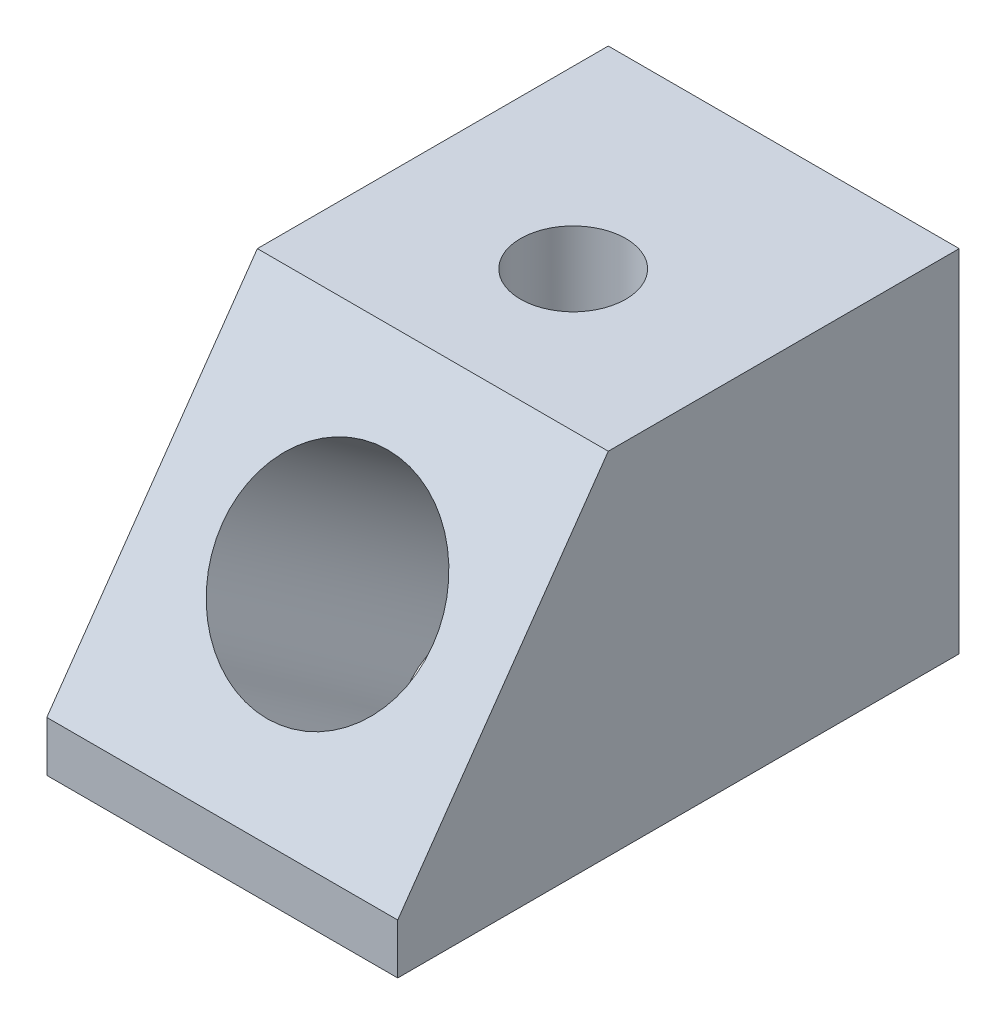
ISO-10303-21;
HEADER;
FILE_DESCRIPTION(('STEP AP214'),'2;1');
FILE_NAME('part.step','',(''),(''),'','','');
FILE_SCHEMA(('AUTOMOTIVE_DESIGN { 1 0 10303 214 1 1 1 1 }'));
ENDSEC;
DATA;
#1=APPLICATION_CONTEXT('core data for automotive mechanical design processes');
#2=APPLICATION_PROTOCOL_DEFINITION('international standard','automotive_design',2000,#1);
#3=PRODUCT_CONTEXT('',#1,'mechanical');
#4=PRODUCT('Part','Part','',(#3));
#5=PRODUCT_RELATED_PRODUCT_CATEGORY('part','',(#4));
#6=PRODUCT_DEFINITION_FORMATION('','',#4);
#7=PRODUCT_DEFINITION_CONTEXT('part definition',#1,'design');
#8=PRODUCT_DEFINITION('design','',#6,#7);
#9=PRODUCT_DEFINITION_SHAPE('','',#8);
#10=(LENGTH_UNIT() NAMED_UNIT(*) SI_UNIT(.MILLI.,.METRE.));
#11=(NAMED_UNIT(*) PLANE_ANGLE_UNIT() SI_UNIT($,.RADIAN.));
#12=(NAMED_UNIT(*) SI_UNIT($,.STERADIAN.) SOLID_ANGLE_UNIT());
#13=UNCERTAINTY_MEASURE_WITH_UNIT(LENGTH_MEASURE(1.E-05),#10,'distance_accuracy_value','');
#14=(GEOMETRIC_REPRESENTATION_CONTEXT(3) GLOBAL_UNCERTAINTY_ASSIGNED_CONTEXT((#13)) GLOBAL_UNIT_ASSIGNED_CONTEXT((#10,
#11,#12)) REPRESENTATION_CONTEXT('',''));
#15=CARTESIAN_POINT('',(0.,0.,0.));
#16=DIRECTION('',(0.,0.,1.));
#17=DIRECTION('',(1.,0.,0.));
#18=AXIS2_PLACEMENT_3D('',#15,#16,#17);
#19=CARTESIAN_POINT('',(0.,10.,0.));
#20=DIRECTION('',(0.,-1.,0.));
#21=DIRECTION('',(0.,0.,-1.));
#22=AXIS2_PLACEMENT_3D('',#19,#20,#21);
#23=PLANE('',#22);
#24=DIRECTION('',(0.,0.,1.));
#25=VECTOR('',#24,1.);
#26=CARTESIAN_POINT('',(0.,10.,0.));
#27=LINE('',#26,#25);
#28=CARTESIAN_POINT('',(0.,10.,-16.));
#29=VERTEX_POINT('',#28);
#30=CARTESIAN_POINT('',(0.,10.,-6.));
#31=VERTEX_POINT('',#30);
#32=EDGE_CURVE('E120',#29,#31,#27,.T.);
#33=ORIENTED_EDGE('',*,*,#32,.T.);
#34=DIRECTION('',(1.,0.,0.));
#35=VECTOR('',#34,1.);
#36=CARTESIAN_POINT('',(-10.4606807737266,10.,-6.));
#37=LINE('',#36,#35);
#38=CARTESIAN_POINT('',(10.,10.,-6.));
#39=VERTEX_POINT('',#38);
#40=EDGE_CURVE('E161',#31,#39,#37,.T.);
#41=ORIENTED_EDGE('',*,*,#40,.T.);
#42=DIRECTION('',(0.,0.,-1.));
#43=VECTOR('',#42,1.);
#44=CARTESIAN_POINT('',(10.,10.,0.));
#45=LINE('',#44,#43);
#46=CARTESIAN_POINT('',(10.,10.,-16.));
#47=VERTEX_POINT('',#46);
#48=EDGE_CURVE('E125',#39,#47,#45,.T.);
#49=ORIENTED_EDGE('',*,*,#48,.T.);
#50=DIRECTION('',(-1.,0.,0.));
#51=VECTOR('',#50,1.);
#52=CARTESIAN_POINT('',(0.,10.,-16.));
#53=LINE('',#52,#51);
#54=EDGE_CURVE('E135',#47,#29,#53,.T.);
#55=ORIENTED_EDGE('',*,*,#54,.T.);
#56=EDGE_LOOP('',(#33,#41,#49,#55));
#57=FACE_BOUND('',#56,.T.);
#58=CARTESIAN_POINT('',(5.,10.,-10.));
#59=DIRECTION('',(0.,1.,0.));
#60=DIRECTION('',(0.,0.,1.));
#61=AXIS2_PLACEMENT_3D('',#58,#59,#60);
#62=CIRCLE('',#61,1.5);
#63=CARTESIAN_POINT('',(5.,10.,-8.5));
#64=VERTEX_POINT('',#63);
#65=EDGE_CURVE('E154',#64,#64,#62,.T.);
#66=ORIENTED_EDGE('',*,*,#65,.F.);
#67=EDGE_LOOP('',(#66));
#68=FACE_BOUND('',#67,.T.);
#69=ADVANCED_FACE('F45',(#57,#68),#23,.F.);
#70=CARTESIAN_POINT('',(0.,0.,0.));
#71=DIRECTION('',(0.,-1.,0.));
#72=DIRECTION('',(0.,0.,-1.));
#73=AXIS2_PLACEMENT_3D('',#70,#71,#72);
#74=PLANE('',#73);
#75=CARTESIAN_POINT('',(5.,0.,-11.1626598799367));
#76=DIRECTION('',(0.,-1.,0.));
#77=DIRECTION('',(0.,0.,1.));
#78=AXIS2_PLACEMENT_3D('',#75,#76,#77);
#79=ELLIPSE('',#78,5.23034038686332,3.);
#80=CARTESIAN_POINT('',(6.14091275769209,0.,-16.));
#81=VERTEX_POINT('',#80);
#82=CARTESIAN_POINT('',(3.85908724230791,0.,-16.));
#83=VERTEX_POINT('',#82);
#84=EDGE_CURVE('E60',#81,#83,#79,.T.);
#85=ORIENTED_EDGE('',*,*,#84,.F.);
#86=DIRECTION('',(-1.,0.,0.));
#87=VECTOR('',#86,1.);
#88=CARTESIAN_POINT('',(0.,0.,-16.));
#89=LINE('',#88,#87);
#90=CARTESIAN_POINT('',(10.,0.,-16.));
#91=VERTEX_POINT('',#90);
#92=EDGE_CURVE('E108',#91,#81,#89,.T.);
#93=ORIENTED_EDGE('',*,*,#92,.F.);
#94=DIRECTION('',(0.,0.,-1.));
#95=VECTOR('',#94,1.);
#96=CARTESIAN_POINT('',(10.,0.,0.));
#97=LINE('',#96,#95);
#98=CARTESIAN_POINT('',(10.,0.,0.));
#99=VERTEX_POINT('',#98);
#100=EDGE_CURVE('E127',#99,#91,#97,.T.);
#101=ORIENTED_EDGE('',*,*,#100,.F.);
#102=DIRECTION('',(1.,0.,0.));
#103=VECTOR('',#102,1.);
#104=CARTESIAN_POINT('',(0.,0.,0.));
#105=LINE('',#104,#103);
#106=CARTESIAN_POINT('',(0.,0.,0.));
#107=VERTEX_POINT('',#106);
#108=EDGE_CURVE('E145',#107,#99,#105,.T.);
#109=ORIENTED_EDGE('',*,*,#108,.F.);
#110=DIRECTION('',(0.,0.,1.));
#111=VECTOR('',#110,1.);
#112=CARTESIAN_POINT('',(0.,0.,0.));
#113=LINE('',#112,#111);
#114=CARTESIAN_POINT('',(0.,0.,-16.));
#115=VERTEX_POINT('',#114);
#116=EDGE_CURVE('E150',#115,#107,#113,.T.);
#117=ORIENTED_EDGE('',*,*,#116,.F.);
#118=EDGE_CURVE('E110',#83,#115,#89,.T.);
#119=ORIENTED_EDGE('',*,*,#118,.F.);
#120=EDGE_LOOP('',(#85,#93,#101,#109,#117,#119));
#121=FACE_BOUND('',#120,.T.);
#122=ADVANCED_FACE('F106',(#121),#74,.T.);
#123=CARTESIAN_POINT('',(0.,10.,0.));
#124=DIRECTION('',(1.,0.,0.));
#125=DIRECTION('',(0.,0.,-1.));
#126=AXIS2_PLACEMENT_3D('',#123,#124,#125);
#127=PLANE('',#126);
#128=DIRECTION('',(0.,-1.,0.));
#129=VECTOR('',#128,1.);
#130=CARTESIAN_POINT('',(0.,10.,0.));
#131=LINE('',#130,#129);
#132=CARTESIAN_POINT('',(0.,1.43111195954726,0.));
#133=VERTEX_POINT('',#132);
#134=EDGE_CURVE('E11',#133,#107,#131,.T.);
#135=ORIENTED_EDGE('',*,*,#134,.F.);
#136=DIRECTION('',(0.,-0.819152044288993,0.573576436351044));
#137=VECTOR('',#136,1.);
#138=CARTESIAN_POINT('',(0.,1.43111195954726,0.));
#139=LINE('',#138,#137);
#140=EDGE_CURVE('E158',#31,#133,#139,.T.);
#141=ORIENTED_EDGE('',*,*,#140,.F.);
#142=ORIENTED_EDGE('',*,*,#32,.F.);
#143=DIRECTION('',(0.,-1.,0.));
#144=VECTOR('',#143,1.);
#145=CARTESIAN_POINT('',(0.,10.,-16.));
#146=LINE('',#145,#144);
#147=EDGE_CURVE('E131',#29,#115,#146,.T.);
#148=ORIENTED_EDGE('',*,*,#147,.T.);
#149=ORIENTED_EDGE('',*,*,#116,.T.);
#150=EDGE_LOOP('',(#135,#141,#142,#148,#149));
#151=FACE_BOUND('',#150,.T.);
#152=ADVANCED_FACE('F47',(#151),#127,.F.);
#153=CARTESIAN_POINT('',(0.,10.,0.));
#154=DIRECTION('',(0.,0.,-1.));
#155=DIRECTION('',(-1.,0.,0.));
#156=AXIS2_PLACEMENT_3D('',#153,#154,#155);
#157=PLANE('',#156);
#158=DIRECTION('',(0.,-1.,0.));
#159=VECTOR('',#158,1.);
#160=CARTESIAN_POINT('',(10.,10.,0.));
#161=LINE('',#160,#159);
#162=CARTESIAN_POINT('',(10.,1.43111195954726,0.));
#163=VERTEX_POINT('',#162);
#164=EDGE_CURVE('E54',#163,#99,#161,.T.);
#165=ORIENTED_EDGE('',*,*,#164,.F.);
#166=DIRECTION('',(1.,0.,0.));
#167=VECTOR('',#166,1.);
#168=CARTESIAN_POINT('',(-10.4606807737266,1.43111195954726,0.));
#169=LINE('',#168,#167);
#170=EDGE_CURVE('E68',#133,#163,#169,.T.);
#171=ORIENTED_EDGE('',*,*,#170,.F.);
#172=ORIENTED_EDGE('',*,*,#134,.T.);
#173=ORIENTED_EDGE('',*,*,#108,.T.);
#174=EDGE_LOOP('',(#165,#171,#172,#173));
#175=FACE_BOUND('',#174,.T.);
#176=ADVANCED_FACE('F146',(#175),#157,.F.);
#177=CARTESIAN_POINT('',(10.,10.,0.));
#178=DIRECTION('',(-1.,0.,0.));
#179=DIRECTION('',(0.,0.,1.));
#180=AXIS2_PLACEMENT_3D('',#177,#178,#179);
#181=PLANE('',#180);
#182=ORIENTED_EDGE('',*,*,#48,.F.);
#183=DIRECTION('',(0.,0.819152044288993,-0.573576436351044));
#184=VECTOR('',#183,1.);
#185=CARTESIAN_POINT('',(10.,1.43111195954726,0.));
#186=LINE('',#185,#184);
#187=EDGE_CURVE('E112',#163,#39,#186,.T.);
#188=ORIENTED_EDGE('',*,*,#187,.F.);
#189=ORIENTED_EDGE('',*,*,#164,.T.);
#190=ORIENTED_EDGE('',*,*,#100,.T.);
#191=DIRECTION('',(0.,-1.,0.));
#192=VECTOR('',#191,1.);
#193=CARTESIAN_POINT('',(10.,10.,-16.));
#194=LINE('',#193,#192);
#195=EDGE_CURVE('E118',#47,#91,#194,.T.);
#196=ORIENTED_EDGE('',*,*,#195,.F.);
#197=EDGE_LOOP('',(#182,#188,#189,#190,#196));
#198=FACE_BOUND('',#197,.T.);
#199=ADVANCED_FACE('F142',(#198),#181,.F.);
#200=CARTESIAN_POINT('',(0.,10.,-16.));
#201=DIRECTION('',(0.,0.,1.));
#202=DIRECTION('',(1.,0.,0.));
#203=AXIS2_PLACEMENT_3D('',#200,#201,#202);
#204=PLANE('',#203);
#205=ORIENTED_EDGE('',*,*,#92,.T.);
#206=CARTESIAN_POINT('',(5.,-3.38714201695254,-16.));
#207=DIRECTION('',(0.,0.,1.));
#208=DIRECTION('',(0.,1.,0.));
#209=AXIS2_PLACEMENT_3D('',#206,#207,#208);
#210=ELLIPSE('',#209,3.66232376628436,3.);
#211=EDGE_CURVE('E95',#81,#83,#210,.T.);
#212=ORIENTED_EDGE('',*,*,#211,.T.);
#213=ORIENTED_EDGE('',*,*,#118,.T.);
#214=ORIENTED_EDGE('',*,*,#147,.F.);
#215=ORIENTED_EDGE('',*,*,#54,.F.);
#216=ORIENTED_EDGE('',*,*,#195,.T.);
#217=EDGE_LOOP('',(#205,#212,#213,#214,#215,#216));
#218=FACE_BOUND('',#217,.T.);
#219=ADVANCED_FACE('F115',(#218),#204,.F.);
#220=CARTESIAN_POINT('',(5.,10.,-10.));
#221=DIRECTION('',(0.,-1.,0.));
#222=DIRECTION('',(0.,0.,-1.));
#223=AXIS2_PLACEMENT_3D('',#220,#221,#222);
#224=CYLINDRICAL_SURFACE('',#223,1.5);
#225=CARTESIAN_POINT('',(5.,3.4261156712755,-11.5));
#226=CARTESIAN_POINT('',(4.91660658217662,3.42611355881641,-11.4999966564749));
#227=CARTESIAN_POINT('',(4.83309840126524,3.42672001902729,-11.4930169721192));
#228=CARTESIAN_POINT('',(4.66830008303787,3.42939227912251,-11.4652589804488));
#229=CARTESIAN_POINT('',(4.58701528548461,3.43146131808375,-11.4444500525515));
#230=CARTESIAN_POINT('',(4.4291187842546,3.43780262071614,-11.3896296631994));
#231=CARTESIAN_POINT('',(4.35250580672994,3.44207428077569,-11.3556218194384));
#232=CARTESIAN_POINT('',(4.20623151413681,3.45399412828051,-11.2754923729303));
#233=CARTESIAN_POINT('',(4.13656628537528,3.46164040147181,-11.2293776438302));
#234=CARTESIAN_POINT('',(4.00711635332639,3.4816536660274,-11.127333446072));
#235=CARTESIAN_POINT('',(3.94721193039157,3.49395613146182,-11.0715435404979));
#236=CARTESIAN_POINT('',(3.83794714741204,3.5247279570921,-10.9519385311868));
#237=CARTESIAN_POINT('',(3.78858220323081,3.54319462717668,-10.8881269357433));
#238=CARTESIAN_POINT('',(3.70326098005547,3.58647013667885,-10.7578252319978));
#239=CARTESIAN_POINT('',(3.66685835882191,3.61100477303053,-10.6915354349523));
#240=CARTESIAN_POINT('',(3.60517969088255,3.66694736092377,-10.5567528322082));
#241=CARTESIAN_POINT('',(3.57990386975756,3.698355451796,-10.4882599818758));
#242=CARTESIAN_POINT('',(3.53968470843463,3.76807225673057,-10.3503290748429));
#243=CARTESIAN_POINT('',(3.52491454564902,3.80648407360437,-10.2808935852263));
#244=CARTESIAN_POINT('',(3.50531365015183,3.88876732332052,-10.143906893707));
#245=CARTESIAN_POINT('',(3.50049032852916,3.93264280118111,-10.0763571337411));
#246=CARTESIAN_POINT('',(3.49933204554683,4.04959734118705,-9.90818310401768));
#247=CARTESIAN_POINT('',(3.50903649911307,4.12558643320216,-9.80954009732762));
#248=CARTESIAN_POINT('',(3.54564985653891,4.2832870851801,-9.62026019254547));
#249=CARTESIAN_POINT('',(3.57260478266779,4.36501343062844,-9.52964545137843));
#250=CARTESIAN_POINT('',(3.64283435157179,4.53293891445606,-9.3540086630779));
#251=CARTESIAN_POINT('',(3.6865655364101,4.61919891103365,-9.2692293954091));
#252=CARTESIAN_POINT('',(3.78992467878587,4.79027264723536,-9.10845794677279));
#253=CARTESIAN_POINT('',(3.84953287879425,4.87508804591298,-9.03245501180854));
#254=CARTESIAN_POINT('',(3.96756731696446,5.01693278811864,-8.90947277797461));
#255=CARTESIAN_POINT('',(4.02198929290211,5.07529410682447,-8.86018919327136));
#256=CARTESIAN_POINT('',(4.14099445126438,5.18655150392528,-8.76802428782936));
#257=CARTESIAN_POINT('',(4.20556321454727,5.23945516387561,-8.72513404781086));
#258=CARTESIAN_POINT('',(4.32639008733714,5.32280432991543,-8.65850760727582));
#259=CARTESIAN_POINT('',(4.380021310847,5.35541779455148,-8.63275243582545));
#260=CARTESIAN_POINT('',(4.49311022792227,5.41389439445958,-8.58692968350197));
#261=CARTESIAN_POINT('',(4.55255825525506,5.4397684755576,-8.56685287545523));
#262=CARTESIAN_POINT('',(4.66433333302122,5.47825682703631,-8.53713247581061));
#263=CARTESIAN_POINT('',(4.71575995012206,5.49247840635904,-8.5262132993295));
#264=CARTESIAN_POINT('',(4.8208933178688,5.51391897403146,-8.50978436927605));
#265=CARTESIAN_POINT('',(4.87459800924185,5.52114415170182,-8.50426983447057));
#266=CARTESIAN_POINT('',(4.98297599706188,5.52789986045444,-8.4991129291859));
#267=CARTESIAN_POINT('',(5.0376520503203,5.52740304936799,-8.49949142487232));
#268=CARTESIAN_POINT('',(5.14602446136197,5.51869975252877,-8.50613669740088));
#269=CARTESIAN_POINT('',(5.19972041240727,5.51049013696336,-8.51240586464454));
#270=CARTESIAN_POINT('',(5.30223784231097,5.48769712720785,-8.52988502668813));
#271=CARTESIAN_POINT('',(5.35116994468328,5.47341872763235,-8.54085878943631));
#272=CARTESIAN_POINT('',(5.44597503663425,5.43961198051456,-8.56698632507224));
#273=CARTESIAN_POINT('',(5.49184685405946,5.42008163561261,-8.58214168831558));
#274=CARTESIAN_POINT('',(5.6069573533272,5.36372670318288,-8.62618280027028));
#275=CARTESIAN_POINT('',(5.67351748808123,5.32359268257833,-8.65782456240205));
#276=CARTESIAN_POINT('',(5.79790985834455,5.23618575684114,-8.7278109423991));
#277=CARTESIAN_POINT('',(5.85571477047151,5.1888913879778,-8.76617576956914));
#278=CARTESIAN_POINT('',(5.95075098452839,5.10124381678207,-8.83863576487883));
#279=CARTESIAN_POINT('',(5.98965464457881,5.06180017775716,-8.87167969930187));
#280=CARTESIAN_POINT('',(6.06295871401373,4.98106821317479,-8.94044955434028));
#281=CARTESIAN_POINT('',(6.09735661993812,4.93977887906659,-8.97617694872521));
#282=CARTESIAN_POINT('',(6.16192458459107,4.85599063968954,-9.05008334160746));
#283=CARTESIAN_POINT('',(6.19208892375174,4.81349018964554,-9.08826555700536));
#284=CARTESIAN_POINT('',(6.24831014794886,4.72787327611634,-9.16689852778708));
#285=CARTESIAN_POINT('',(6.27436647301999,4.68475672952284,-9.20734959142157));
#286=CARTESIAN_POINT('',(6.3235185383528,4.59645428719662,-9.29231775072066));
#287=CARTESIAN_POINT('',(6.34642955208611,4.55126215227884,-9.33693580066112));
#288=CARTESIAN_POINT('',(6.38778774618033,4.46127182490688,-9.42853766425678));
#289=CARTESIAN_POINT('',(6.40623485135392,4.41647363910038,-9.47552151774401));
#290=CARTESIAN_POINT('',(6.45460021595107,4.28357480066689,-9.61993135521629));
#291=CARTESIAN_POINT('',(6.47767567444764,4.19672771840513,-9.72104315013311));
#292=CARTESIAN_POINT('',(6.49884469635882,4.0543938395324,-9.90318491376403));
#293=CARTESIAN_POINT('',(6.5020810000334,3.9968747839976,-9.98203899222225));
#294=CARTESIAN_POINT('',(6.49528378219694,3.88849165503652,-10.1436766859453));
#295=CARTESIAN_POINT('',(6.48527183023741,3.83761691201322,-10.2264537028696));
#296=CARTESIAN_POINT('',(6.45262459431066,3.75178617968052,-10.3809482179137));
#297=CARTESIAN_POINT('',(6.43215124812101,3.71558563600074,-10.4524235493435));
#298=CARTESIAN_POINT('',(6.37931434178365,3.65044395861914,-10.5943148357231));
#299=CARTESIAN_POINT('',(6.34695580249518,3.62149976817049,-10.6647312249629));
#300=CARTESIAN_POINT('',(6.27015245919032,3.57095962414421,-10.8018104146769));
#301=CARTESIAN_POINT('',(6.22567288771753,3.54938521719352,-10.8684617412412));
#302=CARTESIAN_POINT('',(6.12551622222308,3.5129628761744,-10.9948443982588));
#303=CARTESIAN_POINT('',(6.06983681636698,3.49811633291184,-11.0545742959941));
#304=CARTESIAN_POINT('',(5.95173194124186,3.474395762687,-11.1620163230962));
#305=CARTESIAN_POINT('',(5.88974926314836,3.46527278219805,-11.21016279896));
#306=CARTESIAN_POINT('',(5.75869837870362,3.45063438440778,-11.2963527851996));
#307=CARTESIAN_POINT('',(5.68962652342969,3.44512083582543,-11.3343910561883));
#308=CARTESIAN_POINT('',(5.54370611242187,3.43642160962798,-11.4003664831785));
#309=CARTESIAN_POINT('',(5.46666816943604,3.43332586388256,-11.4278954922178));
#310=CARTESIAN_POINT('',(5.30920472179984,3.42887468629185,-11.4700384818386));
#311=CARTESIAN_POINT('',(5.22878626384449,3.42751580330859,-11.4846780555894));
#312=CARTESIAN_POINT('',(5.12325154206937,3.42655623895893,-11.4951324189768));
#313=CARTESIAN_POINT('',(5.09863940171812,3.42639020502814,-11.4969565539355));
#314=CARTESIAN_POINT('',(5.04935485871077,3.42617023383226,-11.4993908389547));
#315=CARTESIAN_POINT('',(5.02468245608388,3.42611629651284,-11.5000009896034));
#316=CARTESIAN_POINT('',(5.,3.4261156712755,-11.5));
#317=B_SPLINE_CURVE_WITH_KNOTS('',3,(#225,#226,#227,#228,#229,#230,#231,#232,#233,#234,#235,
#236,#237,#238,#239,#240,#241,#242,#243,#244,#245,#246,#247,#248,#249,#250,#251,#252,#253,#254,
#255,#256,#257,#258,#259,#260,#261,#262,#263,#264,#265,#266,#267,#268,#269,#270,#271,#272,#273,
#274,#275,#276,#277,#278,#279,#280,#281,#282,#283,#284,#285,#286,#287,#288,#289,#290,#291,#292,
#293,#294,#295,#296,#297,#298,#299,#300,#301,#302,#303,#304,#305,#306,#307,#308,#309,#310,#311,
#312,#313,#314,#315,#316),.UNSPECIFIED.,.T.,.F.,(4,2,2,2,2,2,2,2,2,2,2,2,2,2,2,2,2,2,2,2,2,2,2,
2,2,2,2,2,2,2,2,2,2,2,2,2,2,2,2,2,2,2,2,2,2,4),(0.,0.250087248354217,0.500730090723549,
0.751304282799836,1.00173651864354,1.24881828380999,1.49579236106296,1.73317347623438,
1.97055940376487,2.21177305265039,2.45316635765492,2.82577835821172,3.19938861230414,
3.58398405135413,3.96810311374208,4.2487835154984,4.52906860296039,4.73197412722788,
4.93454801639,5.09726276708092,5.25983344137726,5.42297987982402,5.58619255078586,
5.74202509049397,5.89791697866811,6.14824588980079,6.39934060922999,6.59261310468566,
6.78599253362683,6.97963075472545,7.17329534796262,7.37562866145248,7.57796538268291,
7.98157505441805,8.27360590430394,8.56516188180662,8.81218046541233,9.05909481665656,
9.30672500005117,9.55440635103702,9.79039028826539,10.0264963055449,10.2710139466373,
10.5150449731767,10.5890648500028,10.6630846909657),.UNSPECIFIED.);
#318=CARTESIAN_POINT('',(5.,3.4261156712755,-11.5));
#319=VERTEX_POINT('',#318);
#320=EDGE_CURVE('E102',#319,#319,#317,.T.);
#321=ORIENTED_EDGE('',*,*,#320,.F.);
#322=EDGE_LOOP('',(#321));
#323=FACE_BOUND('',#322,.T.);
#324=ORIENTED_EDGE('',*,*,#65,.T.);
#325=EDGE_LOOP('',(#324));
#326=FACE_BOUND('',#325,.T.);
#327=ADVANCED_FACE('F183',(#323,#326),#224,.F.);
#328=CARTESIAN_POINT('',(-10.4606807737266,1.43111195954726,0.));
#329=DIRECTION('',(0.,-0.573576436351044,-0.819152044288993));
#330=DIRECTION('',(0.,0.819152044288993,-0.573576436351044));
#331=AXIS2_PLACEMENT_3D('',#328,#329,#330);
#332=PLANE('',#331);
#333=CARTESIAN_POINT('',(5.,5.71555597977363,-3.));
#334=DIRECTION('',(0.,0.573576436351044,0.819152044288993));
#335=DIRECTION('',(0.,-0.819152044288993,0.573576436351044));
#336=AXIS2_PLACEMENT_3D('',#333,#334,#335);
#337=CIRCLE('',#336,3.);
#338=CARTESIAN_POINT('',(5.,3.25809984690665,-1.27927069094687));
#339=VERTEX_POINT('',#338);
#340=EDGE_CURVE('E172',#339,#339,#337,.T.);
#341=ORIENTED_EDGE('',*,*,#340,.F.);
#342=EDGE_LOOP('',(#341));
#343=FACE_BOUND('',#342,.T.);
#344=ORIENTED_EDGE('',*,*,#140,.T.);
#345=ORIENTED_EDGE('',*,*,#170,.T.);
#346=ORIENTED_EDGE('',*,*,#187,.T.);
#347=ORIENTED_EDGE('',*,*,#40,.F.);
#348=EDGE_LOOP('',(#344,#345,#346,#347));
#349=FACE_BOUND('',#348,.T.);
#350=ADVANCED_FACE('F189',(#343,#349),#332,.F.);
#351=CARTESIAN_POINT('',(5.,-2.27280640752753,-14.4085638205579));
#352=DIRECTION('',(0.,0.573576436351044,0.819152044288993));
#353=DIRECTION('',(0.,-0.819152044288993,0.573576436351044));
#354=AXIS2_PLACEMENT_3D('',#351,#352,#353);
#355=CYLINDRICAL_SURFACE('',#354,3.);
#356=ORIENTED_EDGE('',*,*,#84,.T.);
#357=ORIENTED_EDGE('',*,*,#211,.F.);
#358=EDGE_LOOP('',(#356,#357));
#359=FACE_BOUND('',#358,.T.);
#360=ORIENTED_EDGE('',*,*,#320,.T.);
#361=EDGE_LOOP('',(#360));
#362=FACE_BOUND('',#361,.T.);
#363=ORIENTED_EDGE('',*,*,#340,.T.);
#364=EDGE_LOOP('',(#363));
#365=FACE_BOUND('',#364,.T.);
#366=ADVANCED_FACE('F96',(#359,#362,#365),#355,.F.);
#367=CLOSED_SHELL('',(#69,#122,#152,#176,#199,#219,#327,#350,#366));
#368=MANIFOLD_SOLID_BREP('B2',#367);
#369=ADVANCED_BREP_SHAPE_REPRESENTATION('',(#18,#368),#14);
#370=SHAPE_DEFINITION_REPRESENTATION(#9,#369);
ENDSEC;
END-ISO-10303-21;
